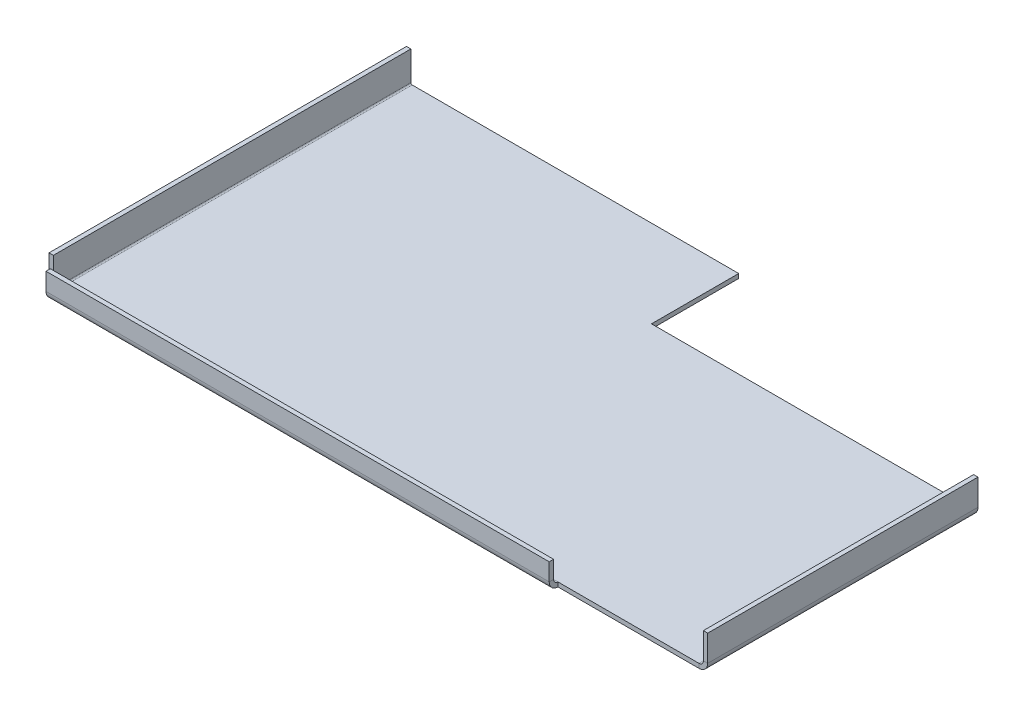
ISO-10303-21;
HEADER;
FILE_DESCRIPTION(('STEP AP214'),'2;1');
FILE_NAME('part.step','',(''),(''),'','','');
FILE_SCHEMA(('AUTOMOTIVE_DESIGN { 1 0 10303 214 1 1 1 1 }'));
ENDSEC;
DATA;
#1=APPLICATION_CONTEXT('core data for automotive mechanical design processes');
#2=APPLICATION_PROTOCOL_DEFINITION('international standard','automotive_design',2000,#1);
#3=PRODUCT_CONTEXT('',#1,'mechanical');
#4=PRODUCT('Part','Part','',(#3));
#5=PRODUCT_RELATED_PRODUCT_CATEGORY('part','',(#4));
#6=PRODUCT_DEFINITION_FORMATION('','',#4);
#7=PRODUCT_DEFINITION_CONTEXT('part definition',#1,'design');
#8=PRODUCT_DEFINITION('design','',#6,#7);
#9=PRODUCT_DEFINITION_SHAPE('','',#8);
#10=(LENGTH_UNIT() NAMED_UNIT(*) SI_UNIT(.MILLI.,.METRE.));
#11=(NAMED_UNIT(*) PLANE_ANGLE_UNIT() SI_UNIT($,.RADIAN.));
#12=(NAMED_UNIT(*) SI_UNIT($,.STERADIAN.) SOLID_ANGLE_UNIT());
#13=UNCERTAINTY_MEASURE_WITH_UNIT(LENGTH_MEASURE(1.E-05),#10,'distance_accuracy_value','');
#14=(GEOMETRIC_REPRESENTATION_CONTEXT(3) GLOBAL_UNCERTAINTY_ASSIGNED_CONTEXT((#13)) GLOBAL_UNIT_ASSIGNED_CONTEXT((#10,
#11,#12)) REPRESENTATION_CONTEXT('',''));
#15=CARTESIAN_POINT('',(0.,0.,0.));
#16=DIRECTION('',(0.,0.,1.));
#17=DIRECTION('',(1.,0.,0.));
#18=AXIS2_PLACEMENT_3D('',#15,#16,#17);
#19=CARTESIAN_POINT('',(0.,-3.17500000000005,-66.675));
#20=DIRECTION('',(0.,0.,1.));
#21=DIRECTION('',(1.,0.,0.));
#22=AXIS2_PLACEMENT_3D('',#19,#20,#21);
#23=PLANE('',#22);
#24=DIRECTION('',(1.,0.,0.));
#25=VECTOR('',#24,1.);
#26=CARTESIAN_POINT('',(0.,0.,-66.675));
#27=LINE('',#26,#25);
#28=CARTESIAN_POINT('',(0.,0.,-66.675));
#29=VERTEX_POINT('',#28);
#30=CARTESIAN_POINT('',(231.42448,0.,-66.675));
#31=VERTEX_POINT('',#30);
#32=EDGE_CURVE('E255',#29,#31,#27,.T.);
#33=ORIENTED_EDGE('',*,*,#32,.T.);
#34=DIRECTION('',(0.,-1.,0.));
#35=VECTOR('',#34,1.);
#36=CARTESIAN_POINT('',(231.42448,0.,-66.675));
#37=LINE('',#36,#35);
#38=CARTESIAN_POINT('',(231.42448,-3.17500000000005,-66.675));
#39=VERTEX_POINT('',#38);
#40=EDGE_CURVE('E13',#31,#39,#37,.T.);
#41=ORIENTED_EDGE('',*,*,#40,.T.);
#42=DIRECTION('',(1.,0.,0.));
#43=VECTOR('',#42,1.);
#44=CARTESIAN_POINT('',(0.,-3.17500000000005,-66.675));
#45=LINE('',#44,#43);
#46=CARTESIAN_POINT('',(0.,-3.17500000000005,-66.675));
#47=VERTEX_POINT('',#46);
#48=EDGE_CURVE('E238',#47,#39,#45,.T.);
#49=ORIENTED_EDGE('',*,*,#48,.F.);
#50=DIRECTION('',(0.,1.,0.));
#51=VECTOR('',#50,1.);
#52=CARTESIAN_POINT('',(0.,-3.17500000000005,-66.675));
#53=LINE('',#52,#51);
#54=EDGE_CURVE('E227',#47,#29,#53,.T.);
#55=ORIENTED_EDGE('',*,*,#54,.T.);
#56=EDGE_LOOP('',(#33,#41,#49,#55));
#57=FACE_BOUND('',#56,.T.);
#58=ADVANCED_FACE('F98',(#57),#23,.F.);
#59=DIRECTION('',(0.,-1.,0.));
#60=VECTOR('',#59,1.);
#61=CARTESIAN_POINT('',(237.77448,-6.04972297714885E-13,-66.675));
#62=LINE('',#61,#60);
#63=CARTESIAN_POINT('',(237.77448,22.225,-66.675));
#64=VERTEX_POINT('',#63);
#65=CARTESIAN_POINT('',(237.77448,3.17499999999998,-66.675));
#66=VERTEX_POINT('',#65);
#67=EDGE_CURVE('E257',#64,#66,#62,.T.);
#68=ORIENTED_EDGE('',*,*,#67,.T.);
#69=DIRECTION('',(-1.,0.,0.));
#70=VECTOR('',#69,1.);
#71=CARTESIAN_POINT('',(237.77448,3.17499999999998,-66.675));
#72=LINE('',#71,#70);
#73=CARTESIAN_POINT('',(234.59948,3.17499999999998,-66.675));
#74=VERTEX_POINT('',#73);
#75=EDGE_CURVE('E106',#66,#74,#72,.T.);
#76=ORIENTED_EDGE('',*,*,#75,.T.);
#77=DIRECTION('',(0.,-1.,0.));
#78=VECTOR('',#77,1.);
#79=CARTESIAN_POINT('',(234.59948,-5.93886844464058E-13,-66.675));
#80=LINE('',#79,#78);
#81=CARTESIAN_POINT('',(234.59948,22.225,-66.675));
#82=VERTEX_POINT('',#81);
#83=EDGE_CURVE('E113',#82,#74,#80,.T.);
#84=ORIENTED_EDGE('',*,*,#83,.F.);
#85=DIRECTION('',(1.,0.,0.));
#86=VECTOR('',#85,1.);
#87=CARTESIAN_POINT('',(237.77448,22.225,-66.675));
#88=LINE('',#87,#86);
#89=EDGE_CURVE('E405',#82,#64,#88,.T.);
#90=ORIENTED_EDGE('',*,*,#89,.T.);
#91=EDGE_LOOP('',(#68,#76,#84,#90));
#92=FACE_BOUND('',#91,.T.);
#93=ADVANCED_FACE('F410',(#92),#23,.F.);
#94=CARTESIAN_POINT('',(-237.77448,-3.175,-130.175));
#95=DIRECTION('',(0.,0.,-1.));
#96=DIRECTION('',(-1.,0.,0.));
#97=AXIS2_PLACEMENT_3D('',#94,#95,#96);
#98=PLANE('',#97);
#99=DIRECTION('',(0.,1.,0.));
#100=VECTOR('',#99,1.);
#101=CARTESIAN_POINT('',(0.,-3.175,-130.175));
#102=LINE('',#101,#100);
#103=CARTESIAN_POINT('',(0.,-3.17500000000005,-130.175));
#104=VERTEX_POINT('',#103);
#105=CARTESIAN_POINT('',(0.,0.,-130.175));
#106=VERTEX_POINT('',#105);
#107=EDGE_CURVE('E262',#104,#106,#102,.T.);
#108=ORIENTED_EDGE('',*,*,#107,.F.);
#109=DIRECTION('',(-1.,0.,0.));
#110=VECTOR('',#109,1.);
#111=CARTESIAN_POINT('',(-237.77448,-3.175,-130.175));
#112=LINE('',#111,#110);
#113=CARTESIAN_POINT('',(-237.77448,-3.175,-130.175));
#114=VERTEX_POINT('',#113);
#115=EDGE_CURVE('E248',#104,#114,#112,.T.);
#116=ORIENTED_EDGE('',*,*,#115,.T.);
#117=DIRECTION('',(0.,1.,0.));
#118=VECTOR('',#117,1.);
#119=CARTESIAN_POINT('',(-237.77448,-3.175,-130.175));
#120=LINE('',#119,#118);
#121=CARTESIAN_POINT('',(-237.77448,0.,-130.175));
#122=VERTEX_POINT('',#121);
#123=EDGE_CURVE('E394',#114,#122,#120,.T.);
#124=ORIENTED_EDGE('',*,*,#123,.T.);
#125=DIRECTION('',(-1.,0.,0.));
#126=VECTOR('',#125,1.);
#127=CARTESIAN_POINT('',(-237.77448,0.,-130.175));
#128=LINE('',#127,#126);
#129=EDGE_CURVE('E385',#106,#122,#128,.T.);
#130=ORIENTED_EDGE('',*,*,#129,.F.);
#131=EDGE_LOOP('',(#108,#116,#124,#130));
#132=FACE_BOUND('',#131,.T.);
#133=ADVANCED_FACE('F100',(#132),#98,.T.);
#134=CARTESIAN_POINT('',(0.,-3.175,0.));
#135=DIRECTION('',(0.,1.,0.));
#136=DIRECTION('',(0.,0.,1.));
#137=AXIS2_PLACEMENT_3D('',#134,#135,#136);
#138=PLANE('',#137);
#139=DIRECTION('',(0.,0.,1.));
#140=VECTOR('',#139,1.);
#141=CARTESIAN_POINT('',(0.,-3.17500000000005,-188.955894256678));
#142=LINE('',#141,#140);
#143=EDGE_CURVE('E231',#104,#47,#142,.T.);
#144=ORIENTED_EDGE('',*,*,#143,.T.);
#145=ORIENTED_EDGE('',*,*,#48,.T.);
#146=DIRECTION('',(0.,0.,-1.));
#147=VECTOR('',#146,1.);
#148=CARTESIAN_POINT('',(231.42448,-3.17500000000002,-130.175));
#149=LINE('',#148,#147);
#150=CARTESIAN_POINT('',(231.42448,-3.175,130.175));
#151=VERTEX_POINT('',#150);
#152=EDGE_CURVE('E331',#39,#151,#149,.F.);
#153=ORIENTED_EDGE('',*,*,#152,.T.);
#154=DIRECTION('',(1.,0.,0.));
#155=VECTOR('',#154,1.);
#156=CARTESIAN_POINT('',(-237.77448,-3.175,130.175));
#157=LINE('',#156,#155);
#158=CARTESIAN_POINT('',(128.70688,-3.175,130.175));
#159=VERTEX_POINT('',#158);
#160=EDGE_CURVE('E391',#159,#151,#157,.T.);
#161=ORIENTED_EDGE('',*,*,#160,.F.);
#162=CARTESIAN_POINT('',(-237.77448,-3.17500000000005,130.175));
#163=VERTEX_POINT('',#162);
#164=EDGE_CURVE('E392',#163,#159,#157,.T.);
#165=ORIENTED_EDGE('',*,*,#164,.F.);
#166=DIRECTION('',(0.,0.,1.));
#167=VECTOR('',#166,1.);
#168=CARTESIAN_POINT('',(-237.77448,-3.175,-130.175));
#169=LINE('',#168,#167);
#170=EDGE_CURVE('E387',#114,#163,#169,.T.);
#171=ORIENTED_EDGE('',*,*,#170,.F.);
#172=ORIENTED_EDGE('',*,*,#115,.F.);
#173=EDGE_LOOP('',(#144,#145,#153,#161,#165,#171,#172));
#174=FACE_BOUND('',#173,.T.);
#175=ADVANCED_FACE('F246',(#174),#138,.F.);
#176=CARTESIAN_POINT('',(0.,0.,0.));
#177=DIRECTION('',(0.,1.,0.));
#178=DIRECTION('',(0.,0.,1.));
#179=AXIS2_PLACEMENT_3D('',#176,#177,#178);
#180=PLANE('',#179);
#181=ORIENTED_EDGE('',*,*,#32,.F.);
#182=DIRECTION('',(0.,0.,1.));
#183=VECTOR('',#182,1.);
#184=CARTESIAN_POINT('',(0.,0.,0.));
#185=LINE('',#184,#183);
#186=EDGE_CURVE('E234',#106,#29,#185,.T.);
#187=ORIENTED_EDGE('',*,*,#186,.F.);
#188=ORIENTED_EDGE('',*,*,#129,.T.);
#189=DIRECTION('',(0.,0.,1.));
#190=VECTOR('',#189,1.);
#191=CARTESIAN_POINT('',(-237.77448,0.,-130.175));
#192=LINE('',#191,#190);
#193=CARTESIAN_POINT('',(-237.77448,0.,130.175));
#194=VERTEX_POINT('',#193);
#195=EDGE_CURVE('E396',#122,#194,#192,.T.);
#196=ORIENTED_EDGE('',*,*,#195,.T.);
#197=DIRECTION('',(1.,0.,0.));
#198=VECTOR('',#197,1.);
#199=CARTESIAN_POINT('',(-237.77448,0.,130.175));
#200=LINE('',#199,#198);
#201=CARTESIAN_POINT('',(128.70688,0.,130.175));
#202=VERTEX_POINT('',#201);
#203=EDGE_CURVE('E388',#194,#202,#200,.T.);
#204=ORIENTED_EDGE('',*,*,#203,.T.);
#205=CARTESIAN_POINT('',(231.42448,0.,130.175));
#206=VERTEX_POINT('',#205);
#207=EDGE_CURVE('E399',#202,#206,#200,.T.);
#208=ORIENTED_EDGE('',*,*,#207,.T.);
#209=DIRECTION('',(0.,0.,-1.));
#210=VECTOR('',#209,1.);
#211=CARTESIAN_POINT('',(231.42448,0.,-130.175));
#212=LINE('',#211,#210);
#213=EDGE_CURVE('E312',#31,#206,#212,.F.);
#214=ORIENTED_EDGE('',*,*,#213,.F.);
#215=EDGE_LOOP('',(#181,#187,#188,#196,#204,#208,#214));
#216=FACE_BOUND('',#215,.T.);
#217=ADVANCED_FACE('F542',(#216),#180,.T.);
#218=CARTESIAN_POINT('',(-237.77448,-3.175,130.175));
#219=DIRECTION('',(0.,0.,1.));
#220=DIRECTION('',(1.,0.,0.));
#221=AXIS2_PLACEMENT_3D('',#218,#219,#220);
#222=PLANE('',#221);
#223=DIRECTION('',(0.,-1.,0.));
#224=VECTOR('',#223,1.);
#225=CARTESIAN_POINT('',(231.42448,0.,130.175));
#226=LINE('',#225,#224);
#227=EDGE_CURVE('E337',#206,#151,#226,.T.);
#228=ORIENTED_EDGE('',*,*,#227,.F.);
#229=ORIENTED_EDGE('',*,*,#207,.F.);
#230=DIRECTION('',(0.,-1.,0.));
#231=VECTOR('',#230,1.);
#232=CARTESIAN_POINT('',(128.70688,0.,130.175));
#233=LINE('',#232,#231);
#234=EDGE_CURVE('E376',#202,#159,#233,.T.);
#235=ORIENTED_EDGE('',*,*,#234,.T.);
#236=ORIENTED_EDGE('',*,*,#160,.T.);
#237=EDGE_LOOP('',(#228,#229,#235,#236));
#238=FACE_BOUND('',#237,.T.);
#239=ADVANCED_FACE('F536',(#238),#222,.T.);
#240=CARTESIAN_POINT('',(-237.77448,3.17499999999998,130.175));
#241=DIRECTION('',(-1.,0.,0.));
#242=DIRECTION('',(0.,0.,1.));
#243=AXIS2_PLACEMENT_3D('',#240,#241,#242);
#244=PLANE('',#243);
#245=DIRECTION('',(0.,0.,-1.));
#246=VECTOR('',#245,1.);
#247=CARTESIAN_POINT('',(-237.77448,3.17499999999998,136.525));
#248=LINE('',#247,#246);
#249=CARTESIAN_POINT('',(-237.77448,3.17499999999998,133.35));
#250=VERTEX_POINT('',#249);
#251=CARTESIAN_POINT('',(-237.77448,3.17499999999998,136.525));
#252=VERTEX_POINT('',#251);
#253=EDGE_CURVE('E343',#250,#252,#248,.F.);
#254=ORIENTED_EDGE('',*,*,#253,.F.);
#255=CARTESIAN_POINT('',(-237.77448,3.17499999999998,130.175));
#256=DIRECTION('',(1.,0.,0.));
#257=DIRECTION('',(0.,0.,-1.));
#258=AXIS2_PLACEMENT_3D('',#255,#256,#257);
#259=CIRCLE('',#258,3.17499999999998);
#260=EDGE_CURVE('E378',#194,#250,#259,.F.);
#261=ORIENTED_EDGE('',*,*,#260,.F.);
#262=DIRECTION('',(0.,1.,0.));
#263=VECTOR('',#262,1.);
#264=CARTESIAN_POINT('',(-237.77448,-3.175,130.175));
#265=LINE('',#264,#263);
#266=EDGE_CURVE('E402',#163,#194,#265,.T.);
#267=ORIENTED_EDGE('',*,*,#266,.F.);
#268=CARTESIAN_POINT('',(-237.77448,3.17499999999998,130.175));
#269=DIRECTION('',(1.,0.,0.));
#270=DIRECTION('',(0.,0.,-1.));
#271=AXIS2_PLACEMENT_3D('',#268,#269,#270);
#272=CIRCLE('',#271,6.34999999999998);
#273=EDGE_CURVE('E373',#163,#252,#272,.F.);
#274=ORIENTED_EDGE('',*,*,#273,.T.);
#275=EDGE_LOOP('',(#254,#261,#267,#274));
#276=FACE_BOUND('',#275,.T.);
#277=ADVANCED_FACE('F533',(#276),#244,.T.);
#278=CARTESIAN_POINT('',(128.70688,3.17499999999998,130.175));
#279=DIRECTION('',(-1.,0.,0.));
#280=DIRECTION('',(0.,0.,1.));
#281=AXIS2_PLACEMENT_3D('',#278,#279,#280);
#282=PLANE('',#281);
#283=CARTESIAN_POINT('',(128.70688,3.17499999999998,130.175));
#284=DIRECTION('',(1.,0.,0.));
#285=DIRECTION('',(0.,0.,-1.));
#286=AXIS2_PLACEMENT_3D('',#283,#284,#285);
#287=CIRCLE('',#286,3.17499999999998);
#288=CARTESIAN_POINT('',(128.70688,3.17499999999998,133.35));
#289=VERTEX_POINT('',#288);
#290=EDGE_CURVE('E347',#289,#202,#287,.T.);
#291=ORIENTED_EDGE('',*,*,#290,.F.);
#292=DIRECTION('',(0.,0.,-1.));
#293=VECTOR('',#292,1.);
#294=CARTESIAN_POINT('',(128.70688,3.17499999999998,133.35));
#295=LINE('',#294,#293);
#296=CARTESIAN_POINT('',(128.70688,3.17499999999998,136.525));
#297=VERTEX_POINT('',#296);
#298=EDGE_CURVE('E367',#289,#297,#295,.F.);
#299=ORIENTED_EDGE('',*,*,#298,.T.);
#300=CARTESIAN_POINT('',(128.70688,3.17499999999998,130.175));
#301=DIRECTION('',(1.,0.,0.));
#302=DIRECTION('',(0.,0.,-1.));
#303=AXIS2_PLACEMENT_3D('',#300,#301,#302);
#304=CIRCLE('',#303,6.34999999999998);
#305=EDGE_CURVE('E121',#297,#159,#304,.T.);
#306=ORIENTED_EDGE('',*,*,#305,.T.);
#307=ORIENTED_EDGE('',*,*,#234,.F.);
#308=EDGE_LOOP('',(#291,#299,#306,#307));
#309=FACE_BOUND('',#308,.T.);
#310=ADVANCED_FACE('F528',(#309),#282,.F.);
#311=CARTESIAN_POINT('',(128.70688,3.17499999999998,130.175));
#312=DIRECTION('',(1.,0.,0.));
#313=DIRECTION('',(0.,0.,1.));
#314=AXIS2_PLACEMENT_3D('',#311,#312,#313);
#315=CYLINDRICAL_SURFACE('',#314,6.34999999999998);
#316=ORIENTED_EDGE('',*,*,#164,.T.);
#317=ORIENTED_EDGE('',*,*,#305,.F.);
#318=DIRECTION('',(1.,0.,0.));
#319=VECTOR('',#318,1.);
#320=CARTESIAN_POINT('',(-237.77448,3.17499999999998,136.525));
#321=LINE('',#320,#319);
#322=EDGE_CURVE('E365',#297,#252,#321,.F.);
#323=ORIENTED_EDGE('',*,*,#322,.T.);
#324=ORIENTED_EDGE('',*,*,#273,.F.);
#325=EDGE_LOOP('',(#316,#317,#323,#324));
#326=FACE_BOUND('',#325,.T.);
#327=ADVANCED_FACE('F525',(#326),#315,.T.);
#328=CARTESIAN_POINT('',(128.70688,3.17499999999998,130.175));
#329=DIRECTION('',(1.,0.,0.));
#330=DIRECTION('',(0.,0.,1.));
#331=AXIS2_PLACEMENT_3D('',#328,#329,#330);
#332=CYLINDRICAL_SURFACE('',#331,3.17499999999998);
#333=ORIENTED_EDGE('',*,*,#203,.F.);
#334=ORIENTED_EDGE('',*,*,#260,.T.);
#335=DIRECTION('',(1.,0.,0.));
#336=VECTOR('',#335,1.);
#337=CARTESIAN_POINT('',(-237.77448,3.17499999999998,133.35));
#338=LINE('',#337,#336);
#339=EDGE_CURVE('E369',#250,#289,#338,.T.);
#340=ORIENTED_EDGE('',*,*,#339,.T.);
#341=ORIENTED_EDGE('',*,*,#290,.T.);
#342=EDGE_LOOP('',(#333,#334,#340,#341));
#343=FACE_BOUND('',#342,.T.);
#344=ADVANCED_FACE('F523',(#343),#332,.F.);
#345=CARTESIAN_POINT('',(128.70688,15.875,136.525));
#346=DIRECTION('',(-1.,0.,0.));
#347=DIRECTION('',(0.,-1.,0.));
#348=AXIS2_PLACEMENT_3D('',#345,#346,#347);
#349=PLANE('',#348);
#350=ORIENTED_EDGE('',*,*,#298,.F.);
#351=DIRECTION('',(0.,-1.,0.));
#352=VECTOR('',#351,1.);
#353=CARTESIAN_POINT('',(128.70688,15.875,133.35));
#354=LINE('',#353,#352);
#355=CARTESIAN_POINT('',(128.70688,15.875,133.35));
#356=VERTEX_POINT('',#355);
#357=EDGE_CURVE('E363',#289,#356,#354,.F.);
#358=ORIENTED_EDGE('',*,*,#357,.T.);
#359=DIRECTION('',(0.,0.,-1.));
#360=VECTOR('',#359,1.);
#361=CARTESIAN_POINT('',(128.70688,15.875,136.525));
#362=LINE('',#361,#360);
#363=CARTESIAN_POINT('',(128.70688,15.875,136.525));
#364=VERTEX_POINT('',#363);
#365=EDGE_CURVE('E344',#364,#356,#362,.T.);
#366=ORIENTED_EDGE('',*,*,#365,.F.);
#367=DIRECTION('',(0.,1.,0.));
#368=VECTOR('',#367,1.);
#369=CARTESIAN_POINT('',(128.70688,-6.75086653245671E-13,136.525));
#370=LINE('',#369,#368);
#371=EDGE_CURVE('E356',#297,#364,#370,.T.);
#372=ORIENTED_EDGE('',*,*,#371,.F.);
#373=EDGE_LOOP('',(#350,#358,#366,#372));
#374=FACE_BOUND('',#373,.T.);
#375=ADVANCED_FACE('F516',(#374),#349,.F.);
#376=CARTESIAN_POINT('',(-237.77448,0.,136.525));
#377=DIRECTION('',(1.,0.,0.));
#378=DIRECTION('',(0.,1.,0.));
#379=AXIS2_PLACEMENT_3D('',#376,#377,#378);
#380=PLANE('',#379);
#381=ORIENTED_EDGE('',*,*,#253,.T.);
#382=DIRECTION('',(0.,-1.,0.));
#383=VECTOR('',#382,1.);
#384=CARTESIAN_POINT('',(-237.77448,1.66288316449936E-12,136.525));
#385=LINE('',#384,#383);
#386=CARTESIAN_POINT('',(-237.77448,15.875,136.525));
#387=VERTEX_POINT('',#386);
#388=EDGE_CURVE('E351',#387,#252,#385,.T.);
#389=ORIENTED_EDGE('',*,*,#388,.F.);
#390=DIRECTION('',(0.,0.,-1.));
#391=VECTOR('',#390,1.);
#392=CARTESIAN_POINT('',(-237.77448,15.875,136.525));
#393=LINE('',#392,#391);
#394=CARTESIAN_POINT('',(-237.77448,15.875,133.35));
#395=VERTEX_POINT('',#394);
#396=EDGE_CURVE('E348',#387,#395,#393,.T.);
#397=ORIENTED_EDGE('',*,*,#396,.T.);
#398=DIRECTION('',(0.,1.,0.));
#399=VECTOR('',#398,1.);
#400=CARTESIAN_POINT('',(-237.77448,0.,133.35));
#401=LINE('',#400,#399);
#402=EDGE_CURVE('E358',#395,#250,#401,.F.);
#403=ORIENTED_EDGE('',*,*,#402,.T.);
#404=EDGE_LOOP('',(#381,#389,#397,#403));
#405=FACE_BOUND('',#404,.T.);
#406=ADVANCED_FACE('F509',(#405),#380,.F.);
#407=CARTESIAN_POINT('',(0.,0.,136.525));
#408=DIRECTION('',(0.,0.,-1.));
#409=DIRECTION('',(-1.,0.,0.));
#410=AXIS2_PLACEMENT_3D('',#407,#408,#409);
#411=PLANE('',#410);
#412=ORIENTED_EDGE('',*,*,#322,.F.);
#413=ORIENTED_EDGE('',*,*,#371,.T.);
#414=DIRECTION('',(-1.,0.,0.));
#415=VECTOR('',#414,1.);
#416=CARTESIAN_POINT('',(0.,15.875,136.525));
#417=LINE('',#416,#415);
#418=EDGE_CURVE('E354',#364,#387,#417,.T.);
#419=ORIENTED_EDGE('',*,*,#418,.T.);
#420=ORIENTED_EDGE('',*,*,#388,.T.);
#421=EDGE_LOOP('',(#412,#413,#419,#420));
#422=FACE_BOUND('',#421,.T.);
#423=ADVANCED_FACE('F505',(#422),#411,.F.);
#424=CARTESIAN_POINT('',(0.,0.,133.35));
#425=DIRECTION('',(0.,0.,-1.));
#426=DIRECTION('',(-1.,0.,0.));
#427=AXIS2_PLACEMENT_3D('',#424,#425,#426);
#428=PLANE('',#427);
#429=ORIENTED_EDGE('',*,*,#357,.F.);
#430=ORIENTED_EDGE('',*,*,#339,.F.);
#431=ORIENTED_EDGE('',*,*,#402,.F.);
#432=DIRECTION('',(1.,0.,0.));
#433=VECTOR('',#432,1.);
#434=CARTESIAN_POINT('',(-237.77448,15.875,133.35));
#435=LINE('',#434,#433);
#436=EDGE_CURVE('E361',#356,#395,#435,.F.);
#437=ORIENTED_EDGE('',*,*,#436,.F.);
#438=EDGE_LOOP('',(#429,#430,#431,#437));
#439=FACE_BOUND('',#438,.T.);
#440=ADVANCED_FACE('F508',(#439),#428,.T.);
#441=CARTESIAN_POINT('',(-237.77448,15.875,136.525));
#442=DIRECTION('',(0.,-1.,0.));
#443=DIRECTION('',(0.,0.,-1.));
#444=AXIS2_PLACEMENT_3D('',#441,#442,#443);
#445=PLANE('',#444);
#446=ORIENTED_EDGE('',*,*,#436,.T.);
#447=ORIENTED_EDGE('',*,*,#396,.F.);
#448=ORIENTED_EDGE('',*,*,#418,.F.);
#449=ORIENTED_EDGE('',*,*,#365,.T.);
#450=EDGE_LOOP('',(#446,#447,#448,#449));
#451=FACE_BOUND('',#450,.T.);
#452=ADVANCED_FACE('F504',(#451),#445,.F.);
#453=CARTESIAN_POINT('',(231.42448,3.17499999999999,130.175));
#454=DIRECTION('',(0.,0.,1.));
#455=DIRECTION('',(1.,0.,0.));
#456=AXIS2_PLACEMENT_3D('',#453,#454,#455);
#457=PLANE('',#456);
#458=DIRECTION('',(1.,0.,0.));
#459=VECTOR('',#458,1.);
#460=CARTESIAN_POINT('',(237.77448,3.17499999999998,130.175));
#461=LINE('',#460,#459);
#462=CARTESIAN_POINT('',(234.59948,3.17499999999998,130.175));
#463=VERTEX_POINT('',#462);
#464=CARTESIAN_POINT('',(237.77448,3.17499999999997,130.175));
#465=VERTEX_POINT('',#464);
#466=EDGE_CURVE('E300',#463,#465,#461,.T.);
#467=ORIENTED_EDGE('',*,*,#466,.F.);
#468=CARTESIAN_POINT('',(231.42448,3.17499999999999,130.175));
#469=DIRECTION('',(0.,0.,-1.));
#470=DIRECTION('',(-1.,0.,0.));
#471=AXIS2_PLACEMENT_3D('',#468,#469,#470);
#472=CIRCLE('',#471,3.17500000000001);
#473=EDGE_CURVE('E334',#206,#463,#472,.F.);
#474=ORIENTED_EDGE('',*,*,#473,.F.);
#475=ORIENTED_EDGE('',*,*,#227,.T.);
#476=CARTESIAN_POINT('',(231.42448,3.17499999999999,130.175));
#477=DIRECTION('',(0.,0.,-1.));
#478=DIRECTION('',(-1.,0.,0.));
#479=AXIS2_PLACEMENT_3D('',#476,#477,#478);
#480=CIRCLE('',#479,6.35000000000001);
#481=EDGE_CURVE('E333',#151,#465,#480,.F.);
#482=ORIENTED_EDGE('',*,*,#481,.T.);
#483=EDGE_LOOP('',(#467,#474,#475,#482));
#484=FACE_BOUND('',#483,.T.);
#485=ADVANCED_FACE('F426',(#484),#457,.T.);
#486=CARTESIAN_POINT('',(231.42448,3.17499999999999,-130.175));
#487=DIRECTION('',(0.,0.,-1.));
#488=DIRECTION('',(1.,0.,0.));
#489=AXIS2_PLACEMENT_3D('',#486,#487,#488);
#490=CYLINDRICAL_SURFACE('',#489,6.35000000000001);
#491=CARTESIAN_POINT('',(231.42448,3.17499999999999,-66.675));
#492=DIRECTION('',(0.,0.,1.));
#493=DIRECTION('',(1.,0.,0.));
#494=AXIS2_PLACEMENT_3D('',#491,#492,#493);
#495=CIRCLE('',#494,6.35000000000001);
#496=EDGE_CURVE('E260',#66,#39,#495,.F.);
#497=ORIENTED_EDGE('',*,*,#496,.F.);
#498=DIRECTION('',(0.,0.,-1.));
#499=VECTOR('',#498,1.);
#500=CARTESIAN_POINT('',(237.77448,3.17499999999998,0.));
#501=LINE('',#500,#499);
#502=EDGE_CURVE('E323',#465,#66,#501,.T.);
#503=ORIENTED_EDGE('',*,*,#502,.F.);
#504=ORIENTED_EDGE('',*,*,#481,.F.);
#505=ORIENTED_EDGE('',*,*,#152,.F.);
#506=EDGE_LOOP('',(#497,#503,#504,#505));
#507=FACE_BOUND('',#506,.T.);
#508=ADVANCED_FACE('F496',(#507),#490,.T.);
#509=CARTESIAN_POINT('',(231.42448,3.17499999999999,-130.175));
#510=DIRECTION('',(0.,0.,-1.));
#511=DIRECTION('',(1.,0.,0.));
#512=AXIS2_PLACEMENT_3D('',#509,#510,#511);
#513=CYLINDRICAL_SURFACE('',#512,3.17500000000001);
#514=DIRECTION('',(0.,0.,1.));
#515=VECTOR('',#514,1.);
#516=CARTESIAN_POINT('',(234.59948,3.17499999999998,130.175));
#517=LINE('',#516,#515);
#518=EDGE_CURVE('E326',#463,#74,#517,.F.);
#519=ORIENTED_EDGE('',*,*,#518,.T.);
#520=CARTESIAN_POINT('',(231.42448,3.17499999999999,-66.675));
#521=DIRECTION('',(0.,0.,1.));
#522=DIRECTION('',(1.,0.,0.));
#523=AXIS2_PLACEMENT_3D('',#520,#521,#522);
#524=CIRCLE('',#523,3.17500000000001);
#525=EDGE_CURVE('E252',#74,#31,#524,.F.);
#526=ORIENTED_EDGE('',*,*,#525,.T.);
#527=ORIENTED_EDGE('',*,*,#213,.T.);
#528=ORIENTED_EDGE('',*,*,#473,.T.);
#529=EDGE_LOOP('',(#519,#526,#527,#528));
#530=FACE_BOUND('',#529,.T.);
#531=ADVANCED_FACE('F422',(#530),#513,.F.);
#532=CARTESIAN_POINT('',(237.77448,22.225,130.175));
#533=DIRECTION('',(0.,0.,1.));
#534=DIRECTION('',(0.,-1.,0.));
#535=AXIS2_PLACEMENT_3D('',#532,#533,#534);
#536=PLANE('',#535);
#537=DIRECTION('',(0.,-1.,0.));
#538=VECTOR('',#537,1.);
#539=CARTESIAN_POINT('',(234.59948,-7.56455215927027E-13,130.175));
#540=LINE('',#539,#538);
#541=CARTESIAN_POINT('',(234.59948,22.225,130.175));
#542=VERTEX_POINT('',#541);
#543=EDGE_CURVE('E321',#463,#542,#540,.F.);
#544=ORIENTED_EDGE('',*,*,#543,.F.);
#545=ORIENTED_EDGE('',*,*,#466,.T.);
#546=DIRECTION('',(0.,1.,0.));
#547=VECTOR('',#546,1.);
#548=CARTESIAN_POINT('',(237.77448,22.225,130.175));
#549=LINE('',#548,#547);
#550=CARTESIAN_POINT('',(237.77448,22.225,130.175));
#551=VERTEX_POINT('',#550);
#552=EDGE_CURVE('E316',#465,#551,#549,.T.);
#553=ORIENTED_EDGE('',*,*,#552,.T.);
#554=DIRECTION('',(-1.,0.,0.));
#555=VECTOR('',#554,1.);
#556=CARTESIAN_POINT('',(237.77448,22.225,130.175));
#557=LINE('',#556,#555);
#558=EDGE_CURVE('E309',#551,#542,#557,.T.);
#559=ORIENTED_EDGE('',*,*,#558,.T.);
#560=EDGE_LOOP('',(#544,#545,#553,#559));
#561=FACE_BOUND('',#560,.T.);
#562=ADVANCED_FACE('F430',(#561),#536,.T.);
#563=CARTESIAN_POINT('',(237.77448,-6.04972297714885E-13,0.));
#564=DIRECTION('',(1.,0.,0.));
#565=DIRECTION('',(0.,1.,0.));
#566=AXIS2_PLACEMENT_3D('',#563,#564,#565);
#567=PLANE('',#566);
#568=ORIENTED_EDGE('',*,*,#67,.F.);
#569=DIRECTION('',(0.,0.,-1.));
#570=VECTOR('',#569,1.);
#571=CARTESIAN_POINT('',(237.77448,22.225,-130.175));
#572=LINE('',#571,#570);
#573=EDGE_CURVE('E313',#551,#64,#572,.T.);
#574=ORIENTED_EDGE('',*,*,#573,.F.);
#575=ORIENTED_EDGE('',*,*,#552,.F.);
#576=ORIENTED_EDGE('',*,*,#502,.T.);
#577=EDGE_LOOP('',(#568,#574,#575,#576));
#578=FACE_BOUND('',#577,.T.);
#579=ADVANCED_FACE('F434',(#578),#567,.T.);
#580=CARTESIAN_POINT('',(234.59948,-5.93886844464058E-13,0.));
#581=DIRECTION('',(1.,0.,0.));
#582=DIRECTION('',(0.,1.,0.));
#583=AXIS2_PLACEMENT_3D('',#580,#581,#582);
#584=PLANE('',#583);
#585=DIRECTION('',(0.,0.,1.));
#586=VECTOR('',#585,1.);
#587=CARTESIAN_POINT('',(234.59948,22.225,0.));
#588=LINE('',#587,#586);
#589=EDGE_CURVE('E318',#542,#82,#588,.F.);
#590=ORIENTED_EDGE('',*,*,#589,.T.);
#591=ORIENTED_EDGE('',*,*,#83,.T.);
#592=ORIENTED_EDGE('',*,*,#518,.F.);
#593=ORIENTED_EDGE('',*,*,#543,.T.);
#594=EDGE_LOOP('',(#590,#591,#592,#593));
#595=FACE_BOUND('',#594,.T.);
#596=ADVANCED_FACE('F419',(#595),#584,.F.);
#597=CARTESIAN_POINT('',(237.77448,22.225,-130.175));
#598=DIRECTION('',(0.,1.,0.));
#599=DIRECTION('',(-1.,0.,0.));
#600=AXIS2_PLACEMENT_3D('',#597,#598,#599);
#601=PLANE('',#600);
#602=ORIENTED_EDGE('',*,*,#89,.F.);
#603=ORIENTED_EDGE('',*,*,#589,.F.);
#604=ORIENTED_EDGE('',*,*,#558,.F.);
#605=ORIENTED_EDGE('',*,*,#573,.T.);
#606=EDGE_LOOP('',(#602,#603,#604,#605));
#607=FACE_BOUND('',#606,.T.);
#608=ADVANCED_FACE('F436',(#607),#601,.T.);
#609=CARTESIAN_POINT('',(-237.77448,1.,-130.175));
#610=DIRECTION('',(0.,0.,-1.));
#611=DIRECTION('',(0.,1.,0.));
#612=AXIS2_PLACEMENT_3D('',#609,#610,#611);
#613=PLANE('',#612);
#614=DIRECTION('',(-1.,0.,0.));
#615=VECTOR('',#614,1.);
#616=CARTESIAN_POINT('',(-241.94948,0.999999999999994,-130.175));
#617=LINE('',#616,#615);
#618=CARTESIAN_POINT('',(-238.77448,1.,-130.175));
#619=VERTEX_POINT('',#618);
#620=CARTESIAN_POINT('',(-241.94948,0.999999999999992,-130.175));
#621=VERTEX_POINT('',#620);
#622=EDGE_CURVE('E264',#619,#621,#617,.T.);
#623=ORIENTED_EDGE('',*,*,#622,.F.);
#624=CARTESIAN_POINT('',(-237.77448,1.,-130.175));
#625=DIRECTION('',(0.,0.,1.));
#626=DIRECTION('',(0.,-1.,0.));
#627=AXIS2_PLACEMENT_3D('',#624,#625,#626);
#628=CIRCLE('',#627,1.00000000000003);
#629=EDGE_CURVE('E304',#122,#619,#628,.F.);
#630=ORIENTED_EDGE('',*,*,#629,.F.);
#631=ORIENTED_EDGE('',*,*,#123,.F.);
#632=CARTESIAN_POINT('',(-237.77448,1.,-130.175));
#633=DIRECTION('',(0.,0.,1.));
#634=DIRECTION('',(0.,-1.,0.));
#635=AXIS2_PLACEMENT_3D('',#632,#633,#634);
#636=CIRCLE('',#635,4.17500000000003);
#637=EDGE_CURVE('E297',#114,#621,#636,.F.);
#638=ORIENTED_EDGE('',*,*,#637,.T.);
#639=EDGE_LOOP('',(#623,#630,#631,#638));
#640=FACE_BOUND('',#639,.T.);
#641=ADVANCED_FACE('F438',(#640),#613,.T.);
#642=CARTESIAN_POINT('',(-237.77448,0.999999999999975,130.175));
#643=DIRECTION('',(0.,0.,-1.));
#644=DIRECTION('',(0.,1.,0.));
#645=AXIS2_PLACEMENT_3D('',#642,#643,#644);
#646=PLANE('',#645);
#647=CARTESIAN_POINT('',(-237.77448,0.999999999999975,130.175));
#648=DIRECTION('',(0.,0.,1.));
#649=DIRECTION('',(0.,-1.,0.));
#650=AXIS2_PLACEMENT_3D('',#647,#648,#649);
#651=CIRCLE('',#650,1.00000000000003);
#652=CARTESIAN_POINT('',(-238.77448,0.999999999999973,130.175));
#653=VERTEX_POINT('',#652);
#654=EDGE_CURVE('E267',#653,#194,#651,.T.);
#655=ORIENTED_EDGE('',*,*,#654,.F.);
#656=DIRECTION('',(-1.,0.,0.));
#657=VECTOR('',#656,1.);
#658=CARTESIAN_POINT('',(-238.77448,0.999999999999973,130.175));
#659=LINE('',#658,#657);
#660=CARTESIAN_POINT('',(-241.94948,0.999999999999965,130.175));
#661=VERTEX_POINT('',#660);
#662=EDGE_CURVE('E290',#653,#661,#659,.T.);
#663=ORIENTED_EDGE('',*,*,#662,.T.);
#664=CARTESIAN_POINT('',(-237.77448,0.999999999999975,130.175));
#665=DIRECTION('',(0.,0.,1.));
#666=DIRECTION('',(0.,-1.,0.));
#667=AXIS2_PLACEMENT_3D('',#664,#665,#666);
#668=CIRCLE('',#667,4.17500000000003);
#669=EDGE_CURVE('E301',#661,#163,#668,.T.);
#670=ORIENTED_EDGE('',*,*,#669,.T.);
#671=ORIENTED_EDGE('',*,*,#266,.T.);
#672=EDGE_LOOP('',(#655,#663,#670,#671));
#673=FACE_BOUND('',#672,.T.);
#674=ADVANCED_FACE('F444',(#673),#646,.F.);
#675=CARTESIAN_POINT('',(-237.77448,0.999999999999975,130.175));
#676=DIRECTION('',(0.,0.,1.));
#677=DIRECTION('',(-1.,0.,0.));
#678=AXIS2_PLACEMENT_3D('',#675,#676,#677);
#679=CYLINDRICAL_SURFACE('',#678,4.17500000000003);
#680=ORIENTED_EDGE('',*,*,#170,.T.);
#681=ORIENTED_EDGE('',*,*,#669,.F.);
#682=DIRECTION('',(0.,0.,1.));
#683=VECTOR('',#682,1.);
#684=CARTESIAN_POINT('',(-241.94948,0.999999999999979,0.));
#685=LINE('',#684,#683);
#686=EDGE_CURVE('E287',#621,#661,#685,.T.);
#687=ORIENTED_EDGE('',*,*,#686,.F.);
#688=ORIENTED_EDGE('',*,*,#637,.F.);
#689=EDGE_LOOP('',(#680,#681,#687,#688));
#690=FACE_BOUND('',#689,.T.);
#691=ADVANCED_FACE('F478',(#690),#679,.T.);
#692=CARTESIAN_POINT('',(-237.77448,0.999999999999975,130.175));
#693=DIRECTION('',(0.,0.,1.));
#694=DIRECTION('',(-1.,0.,0.));
#695=AXIS2_PLACEMENT_3D('',#692,#693,#694);
#696=CYLINDRICAL_SURFACE('',#695,1.00000000000003);
#697=ORIENTED_EDGE('',*,*,#195,.F.);
#698=ORIENTED_EDGE('',*,*,#629,.T.);
#699=DIRECTION('',(0.,0.,-1.));
#700=VECTOR('',#699,1.);
#701=CARTESIAN_POINT('',(-238.77448,1.,-130.175));
#702=LINE('',#701,#700);
#703=EDGE_CURVE('E293',#619,#653,#702,.F.);
#704=ORIENTED_EDGE('',*,*,#703,.T.);
#705=ORIENTED_EDGE('',*,*,#654,.T.);
#706=EDGE_LOOP('',(#697,#698,#704,#705));
#707=FACE_BOUND('',#706,.T.);
#708=ADVANCED_FACE('F481',(#707),#696,.F.);
#709=CARTESIAN_POINT('',(-241.94948,0.,130.175));
#710=DIRECTION('',(0.,0.,1.));
#711=DIRECTION('',(1.,0.,0.));
#712=AXIS2_PLACEMENT_3D('',#709,#710,#711);
#713=PLANE('',#712);
#714=DIRECTION('',(0.,-1.,0.));
#715=VECTOR('',#714,1.);
#716=CARTESIAN_POINT('',(-241.94948,0.,130.175));
#717=LINE('',#716,#715);
#718=CARTESIAN_POINT('',(-241.94948,22.225,130.175));
#719=VERTEX_POINT('',#718);
#720=EDGE_CURVE('E271',#719,#661,#717,.T.);
#721=ORIENTED_EDGE('',*,*,#720,.T.);
#722=ORIENTED_EDGE('',*,*,#662,.F.);
#723=DIRECTION('',(0.,1.,0.));
#724=VECTOR('',#723,1.);
#725=CARTESIAN_POINT('',(-238.77448,-5.93886844464058E-13,130.175));
#726=LINE('',#725,#724);
#727=CARTESIAN_POINT('',(-238.77448,22.225,130.175));
#728=VERTEX_POINT('',#727);
#729=EDGE_CURVE('E279',#728,#653,#726,.F.);
#730=ORIENTED_EDGE('',*,*,#729,.F.);
#731=DIRECTION('',(1.,0.,0.));
#732=VECTOR('',#731,1.);
#733=CARTESIAN_POINT('',(-241.94948,22.225,130.175));
#734=LINE('',#733,#732);
#735=EDGE_CURVE('E265',#719,#728,#734,.T.);
#736=ORIENTED_EDGE('',*,*,#735,.F.);
#737=EDGE_LOOP('',(#721,#722,#730,#736));
#738=FACE_BOUND('',#737,.T.);
#739=ADVANCED_FACE('F473',(#738),#713,.T.);
#740=CARTESIAN_POINT('',(-241.94948,22.225,-130.175));
#741=DIRECTION('',(0.,0.,-1.));
#742=DIRECTION('',(0.,1.,0.));
#743=AXIS2_PLACEMENT_3D('',#740,#741,#742);
#744=PLANE('',#743);
#745=DIRECTION('',(0.,-1.,0.));
#746=VECTOR('',#745,1.);
#747=CARTESIAN_POINT('',(-238.77448,-4.31318473001089E-13,-130.175));
#748=LINE('',#747,#746);
#749=CARTESIAN_POINT('',(-238.77448,22.225,-130.175));
#750=VERTEX_POINT('',#749);
#751=EDGE_CURVE('E285',#619,#750,#748,.F.);
#752=ORIENTED_EDGE('',*,*,#751,.F.);
#753=ORIENTED_EDGE('',*,*,#622,.T.);
#754=DIRECTION('',(0.,1.,0.));
#755=VECTOR('',#754,1.);
#756=CARTESIAN_POINT('',(-241.94948,22.225,-130.175));
#757=LINE('',#756,#755);
#758=CARTESIAN_POINT('',(-241.94948,22.225,-130.175));
#759=VERTEX_POINT('',#758);
#760=EDGE_CURVE('E277',#621,#759,#757,.T.);
#761=ORIENTED_EDGE('',*,*,#760,.T.);
#762=DIRECTION('',(1.,0.,0.));
#763=VECTOR('',#762,1.);
#764=CARTESIAN_POINT('',(-241.94948,22.225,-130.175));
#765=LINE('',#764,#763);
#766=EDGE_CURVE('E268',#759,#750,#765,.T.);
#767=ORIENTED_EDGE('',*,*,#766,.T.);
#768=EDGE_LOOP('',(#752,#753,#761,#767));
#769=FACE_BOUND('',#768,.T.);
#770=ADVANCED_FACE('F474',(#769),#744,.T.);
#771=CARTESIAN_POINT('',(-241.94948,-6.04972297714885E-13,0.));
#772=DIRECTION('',(-1.,0.,0.));
#773=DIRECTION('',(0.,-1.,0.));
#774=AXIS2_PLACEMENT_3D('',#771,#772,#773);
#775=PLANE('',#774);
#776=ORIENTED_EDGE('',*,*,#760,.F.);
#777=ORIENTED_EDGE('',*,*,#686,.T.);
#778=ORIENTED_EDGE('',*,*,#720,.F.);
#779=DIRECTION('',(0.,0.,1.));
#780=VECTOR('',#779,1.);
#781=CARTESIAN_POINT('',(-241.94948,22.225,130.175));
#782=LINE('',#781,#780);
#783=EDGE_CURVE('E274',#759,#719,#782,.T.);
#784=ORIENTED_EDGE('',*,*,#783,.F.);
#785=EDGE_LOOP('',(#776,#777,#778,#784));
#786=FACE_BOUND('',#785,.T.);
#787=ADVANCED_FACE('F467',(#786),#775,.T.);
#788=CARTESIAN_POINT('',(-238.77448,-5.93886844464058E-13,0.));
#789=DIRECTION('',(-1.,0.,0.));
#790=DIRECTION('',(0.,-1.,0.));
#791=AXIS2_PLACEMENT_3D('',#788,#789,#790);
#792=PLANE('',#791);
#793=ORIENTED_EDGE('',*,*,#703,.F.);
#794=ORIENTED_EDGE('',*,*,#751,.T.);
#795=DIRECTION('',(0.,0.,-1.));
#796=VECTOR('',#795,1.);
#797=CARTESIAN_POINT('',(-238.77448,22.225,0.));
#798=LINE('',#797,#796);
#799=EDGE_CURVE('E282',#750,#728,#798,.F.);
#800=ORIENTED_EDGE('',*,*,#799,.T.);
#801=ORIENTED_EDGE('',*,*,#729,.T.);
#802=EDGE_LOOP('',(#793,#794,#800,#801));
#803=FACE_BOUND('',#802,.T.);
#804=ADVANCED_FACE('F461',(#803),#792,.F.);
#805=CARTESIAN_POINT('',(-241.94948,22.225,130.175));
#806=DIRECTION('',(0.,1.,0.));
#807=DIRECTION('',(-1.,0.,0.));
#808=AXIS2_PLACEMENT_3D('',#805,#806,#807);
#809=PLANE('',#808);
#810=ORIENTED_EDGE('',*,*,#799,.F.);
#811=ORIENTED_EDGE('',*,*,#766,.F.);
#812=ORIENTED_EDGE('',*,*,#783,.T.);
#813=ORIENTED_EDGE('',*,*,#735,.T.);
#814=EDGE_LOOP('',(#810,#811,#812,#813));
#815=FACE_BOUND('',#814,.T.);
#816=ADVANCED_FACE('F456',(#815),#809,.T.);
#817=ORIENTED_EDGE('',*,*,#40,.F.);
#818=ORIENTED_EDGE('',*,*,#525,.F.);
#819=ORIENTED_EDGE('',*,*,#75,.F.);
#820=ORIENTED_EDGE('',*,*,#496,.T.);
#821=EDGE_LOOP('',(#817,#818,#819,#820));
#822=FACE_BOUND('',#821,.T.);
#823=ADVANCED_FACE('F414',(#822),#23,.F.);
#824=CARTESIAN_POINT('',(0.,-3.17500000000005,-188.955894256678));
#825=DIRECTION('',(-1.,0.,0.));
#826=DIRECTION('',(0.,0.,1.));
#827=AXIS2_PLACEMENT_3D('',#824,#825,#826);
#828=PLANE('',#827);
#829=ORIENTED_EDGE('',*,*,#107,.T.);
#830=ORIENTED_EDGE('',*,*,#186,.T.);
#831=ORIENTED_EDGE('',*,*,#54,.F.);
#832=ORIENTED_EDGE('',*,*,#143,.F.);
#833=EDGE_LOOP('',(#829,#830,#831,#832));
#834=FACE_BOUND('',#833,.T.);
#835=ADVANCED_FACE('F229',(#834),#828,.F.);
#836=CLOSED_SHELL('',(#58,#93,#133,#175,#217,#239,#277,#310,#327,#344,#375,#406,#423,#440,#452,
#485,#508,#531,#562,#579,#596,#608,#641,#674,#691,#708,#739,#770,#787,#804,#816,#823,#835));
#837=MANIFOLD_SOLID_BREP('B2',#836);
#838=ADVANCED_BREP_SHAPE_REPRESENTATION('',(#18,#837),#14);
#839=SHAPE_DEFINITION_REPRESENTATION(#9,#838);
ENDSEC;
END-ISO-10303-21;
